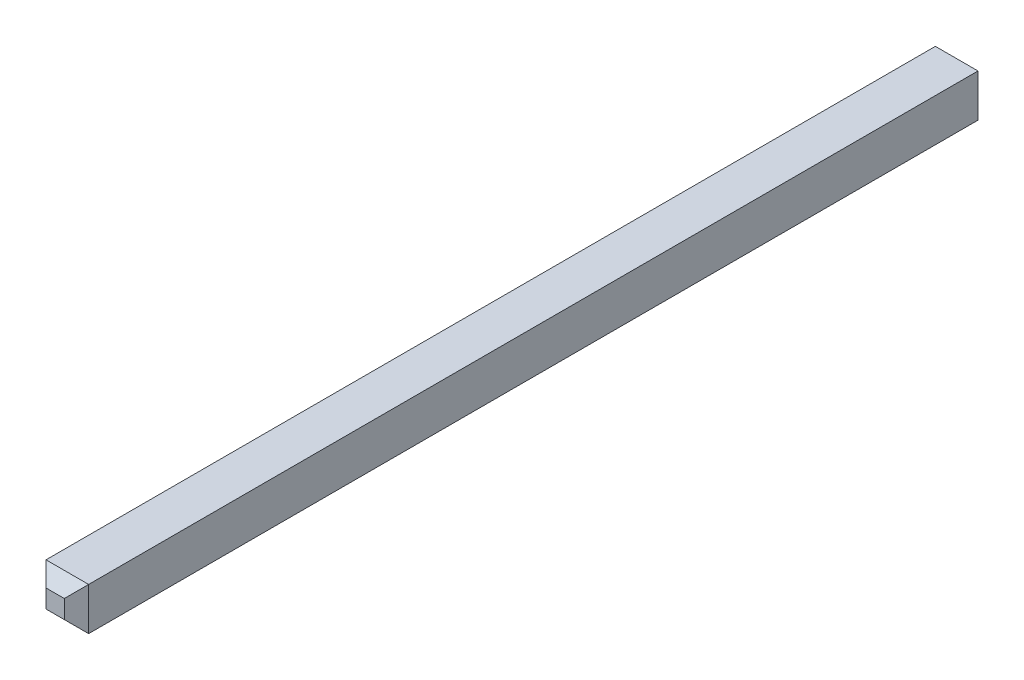
ISO-10303-21;
HEADER;
FILE_DESCRIPTION(('STEP AP214'),'2;1');
FILE_NAME('part.step','',(''),(''),'','','');
FILE_SCHEMA(('AUTOMOTIVE_DESIGN { 1 0 10303 214 1 1 1 1 }'));
ENDSEC;
DATA;
#1=APPLICATION_CONTEXT('core data for automotive mechanical design processes');
#2=APPLICATION_PROTOCOL_DEFINITION('international standard','automotive_design',2000,#1);
#3=PRODUCT_CONTEXT('',#1,'mechanical');
#4=PRODUCT('Part','Part','',(#3));
#5=PRODUCT_RELATED_PRODUCT_CATEGORY('part','',(#4));
#6=PRODUCT_DEFINITION_FORMATION('','',#4);
#7=PRODUCT_DEFINITION_CONTEXT('part definition',#1,'design');
#8=PRODUCT_DEFINITION('design','',#6,#7);
#9=PRODUCT_DEFINITION_SHAPE('','',#8);
#10=(LENGTH_UNIT() NAMED_UNIT(*) SI_UNIT(.MILLI.,.METRE.));
#11=(NAMED_UNIT(*) PLANE_ANGLE_UNIT() SI_UNIT($,.RADIAN.));
#12=(NAMED_UNIT(*) SI_UNIT($,.STERADIAN.) SOLID_ANGLE_UNIT());
#13=UNCERTAINTY_MEASURE_WITH_UNIT(LENGTH_MEASURE(1.E-05),#10,'distance_accuracy_value','');
#14=(GEOMETRIC_REPRESENTATION_CONTEXT(3) GLOBAL_UNCERTAINTY_ASSIGNED_CONTEXT((#13)) GLOBAL_UNIT_ASSIGNED_CONTEXT((#10,
#11,#12)) REPRESENTATION_CONTEXT('',''));
#15=CARTESIAN_POINT('',(0.,0.,0.));
#16=DIRECTION('',(0.,0.,1.));
#17=DIRECTION('',(1.,0.,0.));
#18=AXIS2_PLACEMENT_3D('',#15,#16,#17);
#19=CARTESIAN_POINT('',(33.13264299793,38.2128,7.05));
#20=DIRECTION('',(0.,1.,0.));
#21=DIRECTION('',(1.,0.,0.));
#22=AXIS2_PLACEMENT_3D('',#19,#20,#21);
#23=PLANE('',#22);
#24=DIRECTION('',(-1.,-2.81814293638667E-11,0.));
#25=VECTOR('',#24,1.);
#26=CARTESIAN_POINT('',(33.13264299794,38.21280000001,6.94840000001));
#27=LINE('',#26,#25);
#28=CARTESIAN_POINT('',(33.13264299793,38.2128,6.9484));
#29=VERTEX_POINT('',#28);
#30=CARTESIAN_POINT('',(32.77704299793,38.2128,6.9484));
#31=VERTEX_POINT('',#30);
#32=EDGE_CURVE('E40',#29,#31,#27,.T.);
#33=ORIENTED_EDGE('',*,*,#32,.F.);
#34=DIRECTION('',(0.,0.,1.));
#35=VECTOR('',#34,1.);
#36=CARTESIAN_POINT('',(33.13264299794,38.21280000001,-0.4684000000101));
#37=LINE('',#36,#35);
#38=CARTESIAN_POINT('',(33.13264299793,38.2128,-0.4684000000001));
#39=VERTEX_POINT('',#38);
#40=EDGE_CURVE('E147',#39,#29,#37,.T.);
#41=ORIENTED_EDGE('',*,*,#40,.F.);
#42=DIRECTION('',(1.,0.,0.));
#43=VECTOR('',#42,1.);
#44=CARTESIAN_POINT('',(32.77704299794,38.21280000001,-0.4684000000101));
#45=LINE('',#44,#43);
#46=CARTESIAN_POINT('',(32.77704299793,38.2128,-0.4684000000001));
#47=VERTEX_POINT('',#46);
#48=EDGE_CURVE('E134',#47,#39,#45,.T.);
#49=ORIENTED_EDGE('',*,*,#48,.F.);
#50=DIRECTION('',(0.,0.,1.));
#51=VECTOR('',#50,1.);
#52=CARTESIAN_POINT('',(32.77704299794,38.21280000001,-0.4684000000101));
#53=LINE('',#52,#51);
#54=EDGE_CURVE('E11',#47,#31,#53,.T.);
#55=ORIENTED_EDGE('',*,*,#54,.T.);
#56=EDGE_LOOP('',(#33,#41,#49,#55));
#57=FACE_BOUND('',#56,.T.);
#58=ADVANCED_FACE('F17',(#57),#23,.T.);
#59=CARTESIAN_POINT('',(32.77704299793,38.2128,-0.5700000000001));
#60=DIRECTION('',(-1.,0.,0.));
#61=DIRECTION('',(0.,0.,1.));
#62=AXIS2_PLACEMENT_3D('',#59,#60,#61);
#63=PLANE('',#62);
#64=DIRECTION('',(-2.81614478471136E-11,-1.,0.));
#65=VECTOR('',#64,1.);
#66=CARTESIAN_POINT('',(32.77704299794,38.21280000001,6.94840000001));
#67=LINE('',#66,#65);
#68=CARTESIAN_POINT('',(32.77704299793,37.8572,6.9484));
#69=VERTEX_POINT('',#68);
#70=EDGE_CURVE('E98',#31,#69,#67,.T.);
#71=ORIENTED_EDGE('',*,*,#70,.F.);
#72=ORIENTED_EDGE('',*,*,#54,.F.);
#73=DIRECTION('',(-2.81414663303605E-11,1.,0.));
#74=VECTOR('',#73,1.);
#75=CARTESIAN_POINT('',(32.77704299794,37.85720000001,-0.4684000000101));
#76=LINE('',#75,#74);
#77=CARTESIAN_POINT('',(32.77704299793,37.8572,-0.4684000000001));
#78=VERTEX_POINT('',#77);
#79=EDGE_CURVE('E135',#78,#47,#76,.T.);
#80=ORIENTED_EDGE('',*,*,#79,.F.);
#81=DIRECTION('',(0.,0.,-1.));
#82=VECTOR('',#81,1.);
#83=CARTESIAN_POINT('',(32.77704299794,37.85720000001,6.94840000001));
#84=LINE('',#83,#82);
#85=EDGE_CURVE('E28',#69,#78,#84,.T.);
#86=ORIENTED_EDGE('',*,*,#85,.F.);
#87=EDGE_LOOP('',(#71,#72,#80,#86));
#88=FACE_BOUND('',#87,.T.);
#89=ADVANCED_FACE('F203',(#88),#63,.T.);
#90=CARTESIAN_POINT('',(33.13264299793,37.8572,-0.5700000000001));
#91=DIRECTION('',(0.,-1.,0.));
#92=DIRECTION('',(0.,0.,-1.));
#93=AXIS2_PLACEMENT_3D('',#90,#91,#92);
#94=PLANE('',#93);
#95=DIRECTION('',(1.,-2.81814293638667E-11,0.));
#96=VECTOR('',#95,1.);
#97=CARTESIAN_POINT('',(32.77704299794,37.85720000001,6.94840000001));
#98=LINE('',#97,#96);
#99=CARTESIAN_POINT('',(33.13264299793,37.8572,6.9484));
#100=VERTEX_POINT('',#99);
#101=EDGE_CURVE('E136',#69,#100,#98,.T.);
#102=ORIENTED_EDGE('',*,*,#101,.F.);
#103=ORIENTED_EDGE('',*,*,#85,.T.);
#104=DIRECTION('',(-1.,0.,0.));
#105=VECTOR('',#104,1.);
#106=CARTESIAN_POINT('',(33.13264299794,37.85720000001,-0.4684000000101));
#107=LINE('',#106,#105);
#108=CARTESIAN_POINT('',(33.13264299793,37.8572,-0.4684000000001));
#109=VERTEX_POINT('',#108);
#110=EDGE_CURVE('E124',#109,#78,#107,.T.);
#111=ORIENTED_EDGE('',*,*,#110,.F.);
#112=DIRECTION('',(0.,0.,-1.));
#113=VECTOR('',#112,1.);
#114=CARTESIAN_POINT('',(33.13264299794,37.85720000001,6.94840000001));
#115=LINE('',#114,#113);
#116=EDGE_CURVE('E143',#100,#109,#115,.T.);
#117=ORIENTED_EDGE('',*,*,#116,.F.);
#118=EDGE_LOOP('',(#102,#103,#111,#117));
#119=FACE_BOUND('',#118,.T.);
#120=ADVANCED_FACE('F240',(#119),#94,.T.);
#121=CARTESIAN_POINT('',(33.13264299793,38.2128,-0.5700000000001));
#122=DIRECTION('',(-1.,0.,0.));
#123=DIRECTION('',(0.,0.,1.));
#124=AXIS2_PLACEMENT_3D('',#121,#122,#123);
#125=PLANE('',#124);
#126=DIRECTION('',(-2.81614478471135E-11,1.,0.));
#127=VECTOR('',#126,1.);
#128=CARTESIAN_POINT('',(33.13264299794,37.85720000001,6.94840000001));
#129=LINE('',#128,#127);
#130=EDGE_CURVE('E162',#100,#29,#129,.T.);
#131=ORIENTED_EDGE('',*,*,#130,.F.);
#132=ORIENTED_EDGE('',*,*,#116,.T.);
#133=DIRECTION('',(-2.81614478471136E-11,-1.,0.));
#134=VECTOR('',#133,1.);
#135=CARTESIAN_POINT('',(33.13264299794,38.21280000001,-0.4684000000101));
#136=LINE('',#135,#134);
#137=EDGE_CURVE('E159',#39,#109,#136,.T.);
#138=ORIENTED_EDGE('',*,*,#137,.F.);
#139=ORIENTED_EDGE('',*,*,#40,.T.);
#140=EDGE_LOOP('',(#131,#132,#138,#139));
#141=FACE_BOUND('',#140,.T.);
#142=ADVANCED_FACE('F225',(#141),#125,.F.);
#143=CARTESIAN_POINT('',(33.03104299793,38.2128,-0.5700000000001));
#144=DIRECTION('',(0.707106781186498,0.,-0.707106781186598));
#145=DIRECTION('',(0.,-1.,0.));
#146=AXIS2_PLACEMENT_3D('',#143,#144,#145);
#147=PLANE('',#146);
#148=DIRECTION('',(0.,1.,0.));
#149=VECTOR('',#148,1.);
#150=CARTESIAN_POINT('',(33.03104299794,37.95880000001,-0.5700000000101));
#151=LINE('',#150,#149);
#152=CARTESIAN_POINT('',(33.03104299793,37.9588,-0.5700000000001));
#153=VERTEX_POINT('',#152);
#154=CARTESIAN_POINT('',(33.03104299793,38.1112,-0.5700000000001));
#155=VERTEX_POINT('',#154);
#156=EDGE_CURVE('E122',#153,#155,#151,.T.);
#157=ORIENTED_EDGE('',*,*,#156,.T.);
#158=DIRECTION('',(0.577350269189626,0.577350269189626,0.577350269189626));
#159=VECTOR('',#158,1.);
#160=CARTESIAN_POINT('',(33.03104299794,38.11120000001,-0.5700000000101));
#161=LINE('',#160,#159);
#162=EDGE_CURVE('E169',#155,#39,#161,.T.);
#163=ORIENTED_EDGE('',*,*,#162,.T.);
#164=ORIENTED_EDGE('',*,*,#137,.T.);
#165=DIRECTION('',(-0.577350269189626,0.577350269189626,-0.577350269189626));
#166=VECTOR('',#165,1.);
#167=CARTESIAN_POINT('',(33.13264299794,37.85720000001,-0.4684000000101));
#168=LINE('',#167,#166);
#169=EDGE_CURVE('E128',#109,#153,#168,.T.);
#170=ORIENTED_EDGE('',*,*,#169,.T.);
#171=EDGE_LOOP('',(#157,#163,#164,#170));
#172=FACE_BOUND('',#171,.T.);
#173=ADVANCED_FACE('F278',(#172),#147,.T.);
#174=CARTESIAN_POINT('',(33.13264299793,37.9588,-0.5700000000001));
#175=DIRECTION('',(0.,0.707106781186498,0.707106781186598));
#176=DIRECTION('',(1.,0.,0.));
#177=AXIS2_PLACEMENT_3D('',#174,#175,#176);
#178=PLANE('',#177);
#179=ORIENTED_EDGE('',*,*,#110,.T.);
#180=DIRECTION('',(0.577350269189626,0.577350269189626,-0.577350269189626));
#181=VECTOR('',#180,1.);
#182=CARTESIAN_POINT('',(32.77704299794,37.85720000001,-0.4684000000101));
#183=LINE('',#182,#181);
#184=CARTESIAN_POINT('',(32.87864299793,37.9588,-0.5700000000001));
#185=VERTEX_POINT('',#184);
#186=EDGE_CURVE('E129',#78,#185,#183,.T.);
#187=ORIENTED_EDGE('',*,*,#186,.T.);
#188=DIRECTION('',(1.,0.,0.));
#189=VECTOR('',#188,1.);
#190=CARTESIAN_POINT('',(32.87864299794,37.95880000001,-0.5700000000101));
#191=LINE('',#190,#189);
#192=EDGE_CURVE('E181',#185,#153,#191,.T.);
#193=ORIENTED_EDGE('',*,*,#192,.T.);
#194=ORIENTED_EDGE('',*,*,#169,.F.);
#195=EDGE_LOOP('',(#179,#187,#193,#194));
#196=FACE_BOUND('',#195,.T.);
#197=ADVANCED_FACE('F19',(#196),#178,.F.);
#198=CARTESIAN_POINT('',(33.13264299793,38.2128,-0.5700000000001));
#199=DIRECTION('',(0.,0.,-1.));
#200=DIRECTION('',(0.,-1.,0.));
#201=AXIS2_PLACEMENT_3D('',#198,#199,#200);
#202=PLANE('',#201);
#203=DIRECTION('',(0.,-1.,0.));
#204=VECTOR('',#203,1.);
#205=CARTESIAN_POINT('',(32.87864299794,38.11120000001,-0.5700000000101));
#206=LINE('',#205,#204);
#207=CARTESIAN_POINT('',(32.87864299793,38.1112,-0.5700000000001));
#208=VERTEX_POINT('',#207);
#209=EDGE_CURVE('E130',#208,#185,#206,.T.);
#210=ORIENTED_EDGE('',*,*,#209,.F.);
#211=DIRECTION('',(-1.,0.,0.));
#212=VECTOR('',#211,1.);
#213=CARTESIAN_POINT('',(33.03104299794,38.11120000001,-0.5700000000101));
#214=LINE('',#213,#212);
#215=EDGE_CURVE('E151',#155,#208,#214,.T.);
#216=ORIENTED_EDGE('',*,*,#215,.F.);
#217=ORIENTED_EDGE('',*,*,#156,.F.);
#218=ORIENTED_EDGE('',*,*,#192,.F.);
#219=EDGE_LOOP('',(#210,#216,#217,#218));
#220=FACE_BOUND('',#219,.T.);
#221=ADVANCED_FACE('F208',(#220),#202,.T.);
#222=CARTESIAN_POINT('',(33.13264299793,38.2128,-0.4684000000001));
#223=DIRECTION('',(0.,-0.707106781186498,0.707106781186598));
#224=DIRECTION('',(-1.,0.,0.));
#225=AXIS2_PLACEMENT_3D('',#222,#223,#224);
#226=PLANE('',#225);
#227=ORIENTED_EDGE('',*,*,#215,.T.);
#228=DIRECTION('',(-0.577350269189626,0.577350269189626,0.577350269189626));
#229=VECTOR('',#228,1.);
#230=CARTESIAN_POINT('',(32.87864299794,38.11120000001,-0.5700000000101));
#231=LINE('',#230,#229);
#232=EDGE_CURVE('E148',#208,#47,#231,.T.);
#233=ORIENTED_EDGE('',*,*,#232,.T.);
#234=ORIENTED_EDGE('',*,*,#48,.T.);
#235=ORIENTED_EDGE('',*,*,#162,.F.);
#236=EDGE_LOOP('',(#227,#233,#234,#235));
#237=FACE_BOUND('',#236,.T.);
#238=ADVANCED_FACE('F204',(#237),#226,.F.);
#239=CARTESIAN_POINT('',(32.77704299793,38.2128,-0.4684000000001));
#240=DIRECTION('',(0.707106781186498,0.,0.707106781186598));
#241=DIRECTION('',(0.,-1.,0.));
#242=AXIS2_PLACEMENT_3D('',#239,#240,#241);
#243=PLANE('',#242);
#244=ORIENTED_EDGE('',*,*,#209,.T.);
#245=ORIENTED_EDGE('',*,*,#186,.F.);
#246=ORIENTED_EDGE('',*,*,#79,.T.);
#247=ORIENTED_EDGE('',*,*,#232,.F.);
#248=EDGE_LOOP('',(#244,#245,#246,#247));
#249=FACE_BOUND('',#248,.T.);
#250=ADVANCED_FACE('F194',(#249),#243,.F.);
#251=CARTESIAN_POINT('',(33.03104299793,37.8572,7.05));
#252=DIRECTION('',(0.707106781186548,0.,0.707106781186548));
#253=DIRECTION('',(0.,-1.,0.));
#254=AXIS2_PLACEMENT_3D('',#251,#252,#253);
#255=PLANE('',#254);
#256=ORIENTED_EDGE('',*,*,#130,.T.);
#257=DIRECTION('',(-0.577350269189626,-0.577350269189626,0.577350269189626));
#258=VECTOR('',#257,1.);
#259=CARTESIAN_POINT('',(33.13264299794,38.21280000001,6.94840000001));
#260=LINE('',#259,#258);
#261=CARTESIAN_POINT('',(33.03104299793,38.1112,7.05));
#262=VERTEX_POINT('',#261);
#263=EDGE_CURVE('E165',#29,#262,#260,.T.);
#264=ORIENTED_EDGE('',*,*,#263,.T.);
#265=DIRECTION('',(6.57566685132233E-11,-1.,0.));
#266=VECTOR('',#265,1.);
#267=CARTESIAN_POINT('',(33.03104299794,38.11120000001,7.05000000001));
#268=LINE('',#267,#266);
#269=CARTESIAN_POINT('',(33.03104299793,37.9588,7.05));
#270=VERTEX_POINT('',#269);
#271=EDGE_CURVE('E112',#262,#270,#268,.T.);
#272=ORIENTED_EDGE('',*,*,#271,.T.);
#273=DIRECTION('',(-0.577350269189626,0.577350269189626,0.577350269189626));
#274=VECTOR('',#273,1.);
#275=CARTESIAN_POINT('',(33.13264299794,37.85720000001,6.94840000001));
#276=LINE('',#275,#274);
#277=EDGE_CURVE('E140',#100,#270,#276,.T.);
#278=ORIENTED_EDGE('',*,*,#277,.F.);
#279=EDGE_LOOP('',(#256,#264,#272,#278));
#280=FACE_BOUND('',#279,.T.);
#281=ADVANCED_FACE('F228',(#280),#255,.T.);
#282=CARTESIAN_POINT('',(33.13264299793,37.8572,6.9484));
#283=DIRECTION('',(0.,0.707106781186548,-0.707106781186548));
#284=DIRECTION('',(-1.,0.,0.));
#285=AXIS2_PLACEMENT_3D('',#282,#283,#284);
#286=PLANE('',#285);
#287=ORIENTED_EDGE('',*,*,#101,.T.);
#288=ORIENTED_EDGE('',*,*,#277,.T.);
#289=DIRECTION('',(-1.,6.58499155914009E-11,6.56284537807291E-11));
#290=VECTOR('',#289,1.);
#291=CARTESIAN_POINT('',(33.03104299794,37.95880000001,7.05000000001));
#292=LINE('',#291,#290);
#293=CARTESIAN_POINT('',(32.87864299793,37.9588,7.05));
#294=VERTEX_POINT('',#293);
#295=EDGE_CURVE('E21',#270,#294,#292,.T.);
#296=ORIENTED_EDGE('',*,*,#295,.T.);
#297=DIRECTION('',(-0.577350269189626,-0.577350269189626,-0.577350269189626));
#298=VECTOR('',#297,1.);
#299=CARTESIAN_POINT('',(32.87864299794,37.95880000001,7.05000000001));
#300=LINE('',#299,#298);
#301=EDGE_CURVE('E103',#294,#69,#300,.T.);
#302=ORIENTED_EDGE('',*,*,#301,.T.);
#303=EDGE_LOOP('',(#287,#288,#296,#302));
#304=FACE_BOUND('',#303,.T.);
#305=ADVANCED_FACE('F242',(#304),#286,.F.);
#306=CARTESIAN_POINT('',(32.77704299793,38.2128,6.9484));
#307=DIRECTION('',(0.707106781186548,0.,-0.707106781186548));
#308=DIRECTION('',(0.,-1.,0.));
#309=AXIS2_PLACEMENT_3D('',#306,#307,#308);
#310=PLANE('',#309);
#311=DIRECTION('',(6.57566685132233E-11,1.,0.));
#312=VECTOR('',#311,1.);
#313=CARTESIAN_POINT('',(32.87864299794,37.95880000001,7.05000000001));
#314=LINE('',#313,#312);
#315=CARTESIAN_POINT('',(32.87864299793,38.1112,7.05));
#316=VERTEX_POINT('',#315);
#317=EDGE_CURVE('E97',#294,#316,#314,.T.);
#318=ORIENTED_EDGE('',*,*,#317,.T.);
#319=DIRECTION('',(-0.577350269189626,0.577350269189626,-0.577350269189626));
#320=VECTOR('',#319,1.);
#321=CARTESIAN_POINT('',(32.87864299794,38.11120000001,7.05000000001));
#322=LINE('',#321,#320);
#323=EDGE_CURVE('E88',#316,#31,#322,.T.);
#324=ORIENTED_EDGE('',*,*,#323,.T.);
#325=ORIENTED_EDGE('',*,*,#70,.T.);
#326=ORIENTED_EDGE('',*,*,#301,.F.);
#327=EDGE_LOOP('',(#318,#324,#325,#326));
#328=FACE_BOUND('',#327,.T.);
#329=ADVANCED_FACE('F101',(#328),#310,.F.);
#330=CARTESIAN_POINT('',(33.13264299793,38.1112,7.05));
#331=DIRECTION('',(0.,-0.707106781186548,-0.707106781186548));
#332=DIRECTION('',(0.,-0.707106781186548,0.707106781186548));
#333=AXIS2_PLACEMENT_3D('',#330,#331,#332);
#334=PLANE('',#333);
#335=ORIENTED_EDGE('',*,*,#32,.T.);
#336=ORIENTED_EDGE('',*,*,#323,.F.);
#337=DIRECTION('',(1.,6.58032920523122E-11,0.));
#338=VECTOR('',#337,1.);
#339=CARTESIAN_POINT('',(32.87864299794,38.11120000001,7.05000000001));
#340=LINE('',#339,#338);
#341=EDGE_CURVE('E93',#316,#262,#340,.T.);
#342=ORIENTED_EDGE('',*,*,#341,.T.);
#343=ORIENTED_EDGE('',*,*,#263,.F.);
#344=EDGE_LOOP('',(#335,#336,#342,#343));
#345=FACE_BOUND('',#344,.T.);
#346=ADVANCED_FACE('F90',(#345),#334,.F.);
#347=CARTESIAN_POINT('',(33.13264299793,37.8572,7.05));
#348=DIRECTION('',(0.,0.,1.));
#349=DIRECTION('',(1.,0.,0.));
#350=AXIS2_PLACEMENT_3D('',#347,#348,#349);
#351=PLANE('',#350);
#352=ORIENTED_EDGE('',*,*,#341,.F.);
#353=ORIENTED_EDGE('',*,*,#317,.F.);
#354=ORIENTED_EDGE('',*,*,#295,.F.);
#355=ORIENTED_EDGE('',*,*,#271,.F.);
#356=EDGE_LOOP('',(#352,#353,#354,#355));
#357=FACE_BOUND('',#356,.T.);
#358=ADVANCED_FACE('F110',(#357),#351,.T.);
#359=CLOSED_SHELL('',(#58,#89,#120,#142,#173,#197,#221,#238,#250,#281,#305,#329,#346,#358));
#360=MANIFOLD_SOLID_BREP('B1',#359);
#361=ADVANCED_BREP_SHAPE_REPRESENTATION('',(#18,#360),#14);
#362=SHAPE_DEFINITION_REPRESENTATION(#9,#361);
ENDSEC;
END-ISO-10303-21;
